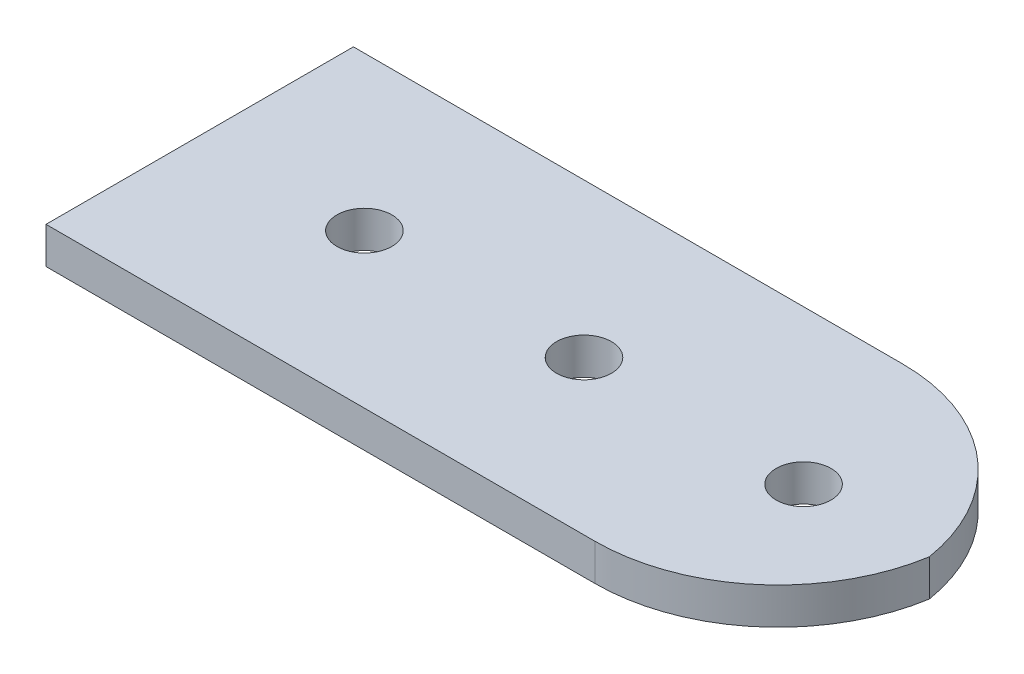
ISO-10303-21;
HEADER;
FILE_DESCRIPTION(('STEP AP214'),'2;1');
FILE_NAME('part.step','',(''),(''),'','','');
FILE_SCHEMA(('AUTOMOTIVE_DESIGN { 1 0 10303 214 1 1 1 1 }'));
ENDSEC;
DATA;
#1=APPLICATION_CONTEXT('core data for automotive mechanical design processes');
#2=APPLICATION_PROTOCOL_DEFINITION('international standard','automotive_design',2000,#1);
#3=PRODUCT_CONTEXT('',#1,'mechanical');
#4=PRODUCT('Part','Part','',(#3));
#5=PRODUCT_RELATED_PRODUCT_CATEGORY('part','',(#4));
#6=PRODUCT_DEFINITION_FORMATION('','',#4);
#7=PRODUCT_DEFINITION_CONTEXT('part definition',#1,'design');
#8=PRODUCT_DEFINITION('design','',#6,#7);
#9=PRODUCT_DEFINITION_SHAPE('','',#8);
#10=(LENGTH_UNIT() NAMED_UNIT(*) SI_UNIT(.MILLI.,.METRE.));
#11=(NAMED_UNIT(*) PLANE_ANGLE_UNIT() SI_UNIT($,.RADIAN.));
#12=(NAMED_UNIT(*) SI_UNIT($,.STERADIAN.) SOLID_ANGLE_UNIT());
#13=UNCERTAINTY_MEASURE_WITH_UNIT(LENGTH_MEASURE(1.E-05),#10,'distance_accuracy_value','');
#14=(GEOMETRIC_REPRESENTATION_CONTEXT(3) GLOBAL_UNCERTAINTY_ASSIGNED_CONTEXT((#13)) GLOBAL_UNIT_ASSIGNED_CONTEXT((#10,
#11,#12)) REPRESENTATION_CONTEXT('',''));
#15=CARTESIAN_POINT('',(0.,0.,0.));
#16=DIRECTION('',(0.,0.,1.));
#17=DIRECTION('',(1.,0.,0.));
#18=AXIS2_PLACEMENT_3D('',#15,#16,#17);
#19=CARTESIAN_POINT('',(0.,2.,-8.4));
#20=DIRECTION('',(0.,0.,-1.));
#21=DIRECTION('',(-1.,0.,0.));
#22=AXIS2_PLACEMENT_3D('',#19,#20,#21);
#23=PLANE('',#22);
#24=DIRECTION('',(1.,0.,0.));
#25=VECTOR('',#24,1.);
#26=CARTESIAN_POINT('',(0.,2.,-8.4));
#27=LINE('',#26,#25);
#28=CARTESIAN_POINT('',(-20.,2.,-8.4));
#29=VERTEX_POINT('',#28);
#30=CARTESIAN_POINT('',(10.,2.,-8.4));
#31=VERTEX_POINT('',#30);
#32=EDGE_CURVE('E97',#29,#31,#27,.T.);
#33=ORIENTED_EDGE('',*,*,#32,.T.);
#34=DIRECTION('',(0.,-1.,0.));
#35=VECTOR('',#34,1.);
#36=CARTESIAN_POINT('',(10.,0.,-8.4));
#37=LINE('',#36,#35);
#38=CARTESIAN_POINT('',(10.,0.,-8.4));
#39=VERTEX_POINT('',#38);
#40=EDGE_CURVE('E106',#31,#39,#37,.T.);
#41=ORIENTED_EDGE('',*,*,#40,.T.);
#42=DIRECTION('',(1.,0.,0.));
#43=VECTOR('',#42,1.);
#44=CARTESIAN_POINT('',(0.,0.,-8.4));
#45=LINE('',#44,#43);
#46=CARTESIAN_POINT('',(-20.,0.,-8.4));
#47=VERTEX_POINT('',#46);
#48=EDGE_CURVE('E100',#47,#39,#45,.T.);
#49=ORIENTED_EDGE('',*,*,#48,.F.);
#50=DIRECTION('',(0.,-1.,0.));
#51=VECTOR('',#50,1.);
#52=CARTESIAN_POINT('',(-20.,2.,-8.4));
#53=LINE('',#52,#51);
#54=EDGE_CURVE('E94',#29,#47,#53,.T.);
#55=ORIENTED_EDGE('',*,*,#54,.F.);
#56=EDGE_LOOP('',(#33,#41,#49,#55));
#57=FACE_BOUND('',#56,.T.);
#58=ADVANCED_FACE('F45',(#57),#23,.T.);
#59=CARTESIAN_POINT('',(-20.,2.,0.));
#60=DIRECTION('',(-1.,0.,0.));
#61=DIRECTION('',(0.,0.,1.));
#62=AXIS2_PLACEMENT_3D('',#59,#60,#61);
#63=PLANE('',#62);
#64=DIRECTION('',(0.,0.,-1.));
#65=VECTOR('',#64,1.);
#66=CARTESIAN_POINT('',(-20.,0.,0.));
#67=LINE('',#66,#65);
#68=CARTESIAN_POINT('',(-20.,0.,8.4));
#69=VERTEX_POINT('',#68);
#70=EDGE_CURVE('E138',#69,#47,#67,.T.);
#71=ORIENTED_EDGE('',*,*,#70,.F.);
#72=DIRECTION('',(0.,-1.,0.));
#73=VECTOR('',#72,1.);
#74=CARTESIAN_POINT('',(-20.,2.,8.4));
#75=LINE('',#74,#73);
#76=CARTESIAN_POINT('',(-20.,2.,8.4));
#77=VERTEX_POINT('',#76);
#78=EDGE_CURVE('E107',#77,#69,#75,.T.);
#79=ORIENTED_EDGE('',*,*,#78,.F.);
#80=DIRECTION('',(0.,0.,-1.));
#81=VECTOR('',#80,1.);
#82=CARTESIAN_POINT('',(-20.,2.,0.));
#83=LINE('',#82,#81);
#84=EDGE_CURVE('E111',#77,#29,#83,.T.);
#85=ORIENTED_EDGE('',*,*,#84,.T.);
#86=ORIENTED_EDGE('',*,*,#54,.T.);
#87=EDGE_LOOP('',(#71,#79,#85,#86));
#88=FACE_BOUND('',#87,.T.);
#89=ADVANCED_FACE('F116',(#88),#63,.T.);
#90=CARTESIAN_POINT('',(0.,2.,8.4));
#91=DIRECTION('',(0.,0.,-1.));
#92=DIRECTION('',(-1.,0.,0.));
#93=AXIS2_PLACEMENT_3D('',#90,#91,#92);
#94=PLANE('',#93);
#95=DIRECTION('',(1.,0.,0.));
#96=VECTOR('',#95,1.);
#97=CARTESIAN_POINT('',(0.,0.,8.4));
#98=LINE('',#97,#96);
#99=CARTESIAN_POINT('',(10.,0.,8.4));
#100=VERTEX_POINT('',#99);
#101=EDGE_CURVE('E141',#69,#100,#98,.T.);
#102=ORIENTED_EDGE('',*,*,#101,.T.);
#103=DIRECTION('',(0.,-1.,0.));
#104=VECTOR('',#103,1.);
#105=CARTESIAN_POINT('',(10.,2.,8.4));
#106=LINE('',#105,#104);
#107=CARTESIAN_POINT('',(10.,2.,8.4));
#108=VERTEX_POINT('',#107);
#109=EDGE_CURVE('E11',#100,#108,#106,.F.);
#110=ORIENTED_EDGE('',*,*,#109,.T.);
#111=DIRECTION('',(1.,0.,0.));
#112=VECTOR('',#111,1.);
#113=CARTESIAN_POINT('',(0.,2.,8.4));
#114=LINE('',#113,#112);
#115=EDGE_CURVE('E118',#77,#108,#114,.T.);
#116=ORIENTED_EDGE('',*,*,#115,.F.);
#117=ORIENTED_EDGE('',*,*,#78,.T.);
#118=EDGE_LOOP('',(#102,#110,#116,#117));
#119=FACE_BOUND('',#118,.T.);
#120=ADVANCED_FACE('F201',(#119),#94,.F.);
#121=CARTESIAN_POINT('',(-11.,2.,0.));
#122=DIRECTION('',(0.,-1.,0.));
#123=DIRECTION('',(0.,0.,-1.));
#124=AXIS2_PLACEMENT_3D('',#121,#122,#123);
#125=CYLINDRICAL_SURFACE('',#124,1.5);
#126=CARTESIAN_POINT('',(-11.,2.,0.));
#127=DIRECTION('',(0.,1.,0.));
#128=DIRECTION('',(0.,0.,1.));
#129=AXIS2_PLACEMENT_3D('',#126,#127,#128);
#130=CIRCLE('',#129,1.5);
#131=CARTESIAN_POINT('',(-11.,2.,1.5));
#132=VERTEX_POINT('',#131);
#133=EDGE_CURVE('E114',#132,#132,#130,.T.);
#134=ORIENTED_EDGE('',*,*,#133,.T.);
#135=EDGE_LOOP('',(#134));
#136=FACE_BOUND('',#135,.T.);
#137=CARTESIAN_POINT('',(-11.,0.,0.));
#138=DIRECTION('',(0.,1.,0.));
#139=DIRECTION('',(0.,0.,1.));
#140=AXIS2_PLACEMENT_3D('',#137,#138,#139);
#141=CIRCLE('',#140,1.5);
#142=CARTESIAN_POINT('',(-11.,0.,1.5));
#143=VERTEX_POINT('',#142);
#144=EDGE_CURVE('E132',#143,#143,#141,.T.);
#145=ORIENTED_EDGE('',*,*,#144,.F.);
#146=EDGE_LOOP('',(#145));
#147=FACE_BOUND('',#146,.T.);
#148=ADVANCED_FACE('F178',(#136,#147),#125,.F.);
#149=CARTESIAN_POINT('',(1.,2.,0.));
#150=DIRECTION('',(0.,-1.,0.));
#151=DIRECTION('',(0.,0.,-1.));
#152=AXIS2_PLACEMENT_3D('',#149,#150,#151);
#153=CYLINDRICAL_SURFACE('',#152,1.5);
#154=CARTESIAN_POINT('',(1.,2.,0.));
#155=DIRECTION('',(0.,1.,0.));
#156=DIRECTION('',(0.,0.,1.));
#157=AXIS2_PLACEMENT_3D('',#154,#155,#156);
#158=CIRCLE('',#157,1.5);
#159=CARTESIAN_POINT('',(1.,2.,1.5));
#160=VERTEX_POINT('',#159);
#161=EDGE_CURVE('E170',#160,#160,#158,.T.);
#162=ORIENTED_EDGE('',*,*,#161,.T.);
#163=EDGE_LOOP('',(#162));
#164=FACE_BOUND('',#163,.T.);
#165=CARTESIAN_POINT('',(1.,0.,0.));
#166=DIRECTION('',(0.,1.,0.));
#167=DIRECTION('',(0.,0.,1.));
#168=AXIS2_PLACEMENT_3D('',#165,#166,#167);
#169=CIRCLE('',#168,1.5);
#170=CARTESIAN_POINT('',(1.,0.,1.5));
#171=VERTEX_POINT('',#170);
#172=EDGE_CURVE('E128',#171,#171,#169,.T.);
#173=ORIENTED_EDGE('',*,*,#172,.F.);
#174=EDGE_LOOP('',(#173));
#175=FACE_BOUND('',#174,.T.);
#176=ADVANCED_FACE('F191',(#164,#175),#153,.F.);
#177=CARTESIAN_POINT('',(13.,2.,0.));
#178=DIRECTION('',(0.,-1.,0.));
#179=DIRECTION('',(0.,0.,-1.));
#180=AXIS2_PLACEMENT_3D('',#177,#178,#179);
#181=CYLINDRICAL_SURFACE('',#180,1.5);
#182=CARTESIAN_POINT('',(13.,2.,0.));
#183=DIRECTION('',(0.,1.,0.));
#184=DIRECTION('',(0.,0.,1.));
#185=AXIS2_PLACEMENT_3D('',#182,#183,#184);
#186=CIRCLE('',#185,1.5);
#187=CARTESIAN_POINT('',(13.,2.,1.5));
#188=VERTEX_POINT('',#187);
#189=EDGE_CURVE('E144',#188,#188,#186,.T.);
#190=ORIENTED_EDGE('',*,*,#189,.T.);
#191=EDGE_LOOP('',(#190));
#192=FACE_BOUND('',#191,.T.);
#193=CARTESIAN_POINT('',(13.,0.,0.));
#194=DIRECTION('',(0.,1.,0.));
#195=DIRECTION('',(0.,0.,1.));
#196=AXIS2_PLACEMENT_3D('',#193,#194,#195);
#197=CIRCLE('',#196,1.5);
#198=CARTESIAN_POINT('',(13.,0.,1.5));
#199=VERTEX_POINT('',#198);
#200=EDGE_CURVE('E124',#199,#199,#197,.T.);
#201=ORIENTED_EDGE('',*,*,#200,.F.);
#202=EDGE_LOOP('',(#201));
#203=FACE_BOUND('',#202,.T.);
#204=ADVANCED_FACE('F182',(#192,#203),#181,.F.);
#205=CARTESIAN_POINT('',(0.,2.,0.));
#206=DIRECTION('',(0.,1.,0.));
#207=DIRECTION('',(0.,0.,1.));
#208=AXIS2_PLACEMENT_3D('',#205,#206,#207);
#209=PLANE('',#208);
#210=ORIENTED_EDGE('',*,*,#189,.F.);
#211=EDGE_LOOP('',(#210));
#212=FACE_BOUND('',#211,.T.);
#213=ORIENTED_EDGE('',*,*,#161,.F.);
#214=EDGE_LOOP('',(#213));
#215=FACE_BOUND('',#214,.T.);
#216=ORIENTED_EDGE('',*,*,#133,.F.);
#217=EDGE_LOOP('',(#216));
#218=FACE_BOUND('',#217,.T.);
#219=CARTESIAN_POINT('',(10.,2.,-1.6));
#220=DIRECTION('',(0.,1.,0.));
#221=DIRECTION('',(0.,0.,1.));
#222=AXIS2_PLACEMENT_3D('',#219,#220,#221);
#223=CIRCLE('',#222,10.);
#224=CARTESIAN_POINT('',(19.8711701434025,2.,0.));
#225=VERTEX_POINT('',#224);
#226=EDGE_CURVE('E62',#108,#225,#223,.T.);
#227=ORIENTED_EDGE('',*,*,#226,.T.);
#228=CARTESIAN_POINT('',(10.,2.,1.6));
#229=DIRECTION('',(0.,1.,0.));
#230=DIRECTION('',(0.,0.,1.));
#231=AXIS2_PLACEMENT_3D('',#228,#229,#230);
#232=CIRCLE('',#231,10.);
#233=EDGE_CURVE('E55',#225,#31,#232,.T.);
#234=ORIENTED_EDGE('',*,*,#233,.T.);
#235=ORIENTED_EDGE('',*,*,#32,.F.);
#236=ORIENTED_EDGE('',*,*,#84,.F.);
#237=ORIENTED_EDGE('',*,*,#115,.T.);
#238=EDGE_LOOP('',(#227,#234,#235,#236,#237));
#239=FACE_BOUND('',#238,.T.);
#240=ADVANCED_FACE('F110',(#212,#215,#218,#239),#209,.T.);
#241=CARTESIAN_POINT('',(0.,0.,0.));
#242=DIRECTION('',(0.,1.,0.));
#243=DIRECTION('',(0.,0.,1.));
#244=AXIS2_PLACEMENT_3D('',#241,#242,#243);
#245=PLANE('',#244);
#246=ORIENTED_EDGE('',*,*,#200,.T.);
#247=EDGE_LOOP('',(#246));
#248=FACE_BOUND('',#247,.T.);
#249=ORIENTED_EDGE('',*,*,#172,.T.);
#250=EDGE_LOOP('',(#249));
#251=FACE_BOUND('',#250,.T.);
#252=ORIENTED_EDGE('',*,*,#144,.T.);
#253=EDGE_LOOP('',(#252));
#254=FACE_BOUND('',#253,.T.);
#255=ORIENTED_EDGE('',*,*,#48,.T.);
#256=CARTESIAN_POINT('',(10.,0.,1.6));
#257=DIRECTION('',(0.,1.,0.));
#258=DIRECTION('',(0.,0.,1.));
#259=AXIS2_PLACEMENT_3D('',#256,#257,#258);
#260=CIRCLE('',#259,10.);
#261=CARTESIAN_POINT('',(19.8711701434025,0.,0.));
#262=VERTEX_POINT('',#261);
#263=EDGE_CURVE('E152',#39,#262,#260,.F.);
#264=ORIENTED_EDGE('',*,*,#263,.T.);
#265=CARTESIAN_POINT('',(10.,0.,-1.6));
#266=DIRECTION('',(0.,1.,0.));
#267=DIRECTION('',(0.,0.,1.));
#268=AXIS2_PLACEMENT_3D('',#265,#266,#267);
#269=CIRCLE('',#268,10.);
#270=EDGE_CURVE('E149',#262,#100,#269,.F.);
#271=ORIENTED_EDGE('',*,*,#270,.T.);
#272=ORIENTED_EDGE('',*,*,#101,.F.);
#273=ORIENTED_EDGE('',*,*,#70,.T.);
#274=EDGE_LOOP('',(#255,#264,#271,#272,#273));
#275=FACE_BOUND('',#274,.T.);
#276=ADVANCED_FACE('F160',(#248,#251,#254,#275),#245,.F.);
#277=CARTESIAN_POINT('',(10.,2.,-1.6));
#278=DIRECTION('',(0.,-1.,0.));
#279=DIRECTION('',(0.,0.,-1.));
#280=AXIS2_PLACEMENT_3D('',#277,#278,#279);
#281=CYLINDRICAL_SURFACE('',#280,10.);
#282=DIRECTION('',(0.,-1.,0.));
#283=VECTOR('',#282,1.);
#284=CARTESIAN_POINT('',(19.8711701434025,1.,0.));
#285=LINE('',#284,#283);
#286=EDGE_CURVE('E49',#225,#262,#285,.T.);
#287=ORIENTED_EDGE('',*,*,#286,.F.);
#288=ORIENTED_EDGE('',*,*,#226,.F.);
#289=ORIENTED_EDGE('',*,*,#109,.F.);
#290=ORIENTED_EDGE('',*,*,#270,.F.);
#291=EDGE_LOOP('',(#287,#288,#289,#290));
#292=FACE_BOUND('',#291,.T.);
#293=ADVANCED_FACE('F47',(#292),#281,.T.);
#294=CARTESIAN_POINT('',(10.,2.,1.6));
#295=DIRECTION('',(0.,1.,0.));
#296=DIRECTION('',(0.,0.,1.));
#297=AXIS2_PLACEMENT_3D('',#294,#295,#296);
#298=CYLINDRICAL_SURFACE('',#297,10.);
#299=ORIENTED_EDGE('',*,*,#233,.F.);
#300=ORIENTED_EDGE('',*,*,#286,.T.);
#301=ORIENTED_EDGE('',*,*,#263,.F.);
#302=ORIENTED_EDGE('',*,*,#40,.F.);
#303=EDGE_LOOP('',(#299,#300,#301,#302));
#304=FACE_BOUND('',#303,.T.);
#305=ADVANCED_FACE('F165',(#304),#298,.T.);
#306=CLOSED_SHELL('',(#58,#89,#120,#148,#176,#204,#240,#276,#293,#305));
#307=MANIFOLD_SOLID_BREP('B2',#306);
#308=ADVANCED_BREP_SHAPE_REPRESENTATION('',(#18,#307),#14);
#309=SHAPE_DEFINITION_REPRESENTATION(#9,#308);
ENDSEC;
END-ISO-10303-21;
